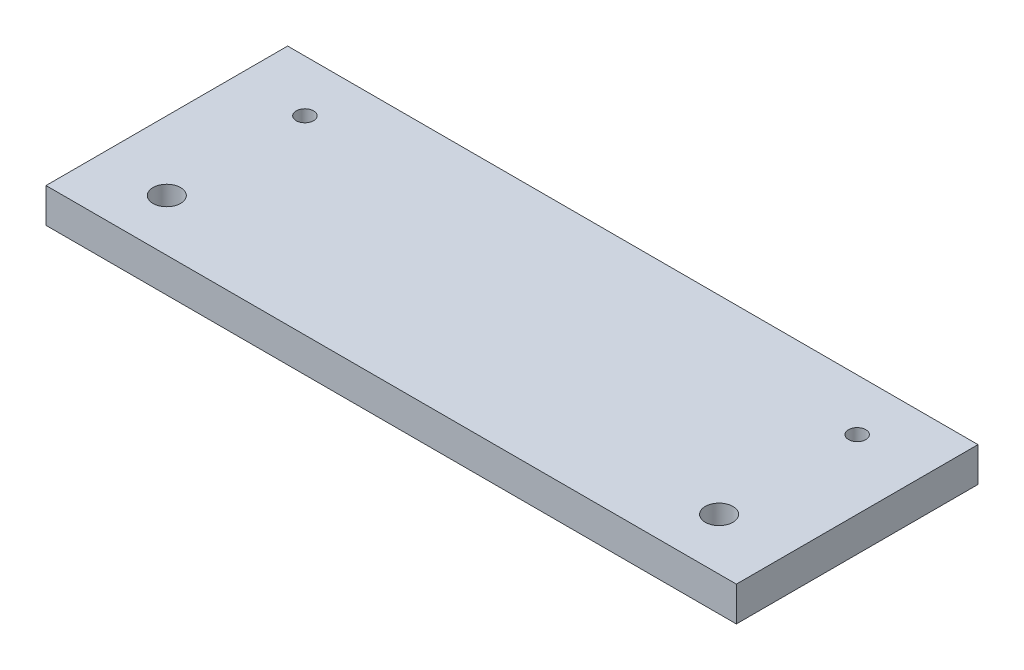
ISO-10303-21;
HEADER;
FILE_DESCRIPTION(('STEP AP214'),'2;1');
FILE_NAME('part.step','',(''),(''),'','','');
FILE_SCHEMA(('AUTOMOTIVE_DESIGN { 1 0 10303 214 1 1 1 1 }'));
ENDSEC;
DATA;
#1=APPLICATION_CONTEXT('core data for automotive mechanical design processes');
#2=APPLICATION_PROTOCOL_DEFINITION('international standard','automotive_design',2000,#1);
#3=PRODUCT_CONTEXT('',#1,'mechanical');
#4=PRODUCT('Part','Part','',(#3));
#5=PRODUCT_RELATED_PRODUCT_CATEGORY('part','',(#4));
#6=PRODUCT_DEFINITION_FORMATION('','',#4);
#7=PRODUCT_DEFINITION_CONTEXT('part definition',#1,'design');
#8=PRODUCT_DEFINITION('design','',#6,#7);
#9=PRODUCT_DEFINITION_SHAPE('','',#8);
#10=(LENGTH_UNIT() NAMED_UNIT(*) SI_UNIT(.MILLI.,.METRE.));
#11=(NAMED_UNIT(*) PLANE_ANGLE_UNIT() SI_UNIT($,.RADIAN.));
#12=(NAMED_UNIT(*) SI_UNIT($,.STERADIAN.) SOLID_ANGLE_UNIT());
#13=UNCERTAINTY_MEASURE_WITH_UNIT(LENGTH_MEASURE(1.E-05),#10,'distance_accuracy_value','');
#14=(GEOMETRIC_REPRESENTATION_CONTEXT(3) GLOBAL_UNCERTAINTY_ASSIGNED_CONTEXT((#13)) GLOBAL_UNIT_ASSIGNED_CONTEXT((#10,
#11,#12)) REPRESENTATION_CONTEXT('',''));
#15=CARTESIAN_POINT('',(0.,0.,0.));
#16=DIRECTION('',(0.,0.,1.));
#17=DIRECTION('',(1.,0.,0.));
#18=AXIS2_PLACEMENT_3D('',#15,#16,#17);
#19=CARTESIAN_POINT('',(0.,10.,0.));
#20=DIRECTION('',(0.,-1.,0.));
#21=DIRECTION('',(0.,0.,-1.));
#22=AXIS2_PLACEMENT_3D('',#19,#20,#21);
#23=PLANE('',#22);
#24=CARTESIAN_POINT('',(-80.,10.,20.));
#25=DIRECTION('',(0.,1.,0.));
#26=DIRECTION('',(0.,0.,1.));
#27=AXIS2_PLACEMENT_3D('',#24,#25,#26);
#28=CIRCLE('',#27,4.00000000000001);
#29=CARTESIAN_POINT('',(-80.,10.,24.));
#30=VERTEX_POINT('',#29);
#31=EDGE_CURVE('E139',#30,#30,#28,.T.);
#32=ORIENTED_EDGE('',*,*,#31,.F.);
#33=EDGE_LOOP('',(#32));
#34=FACE_BOUND('',#33,.T.);
#35=CARTESIAN_POINT('',(80.,10.,20.));
#36=DIRECTION('',(0.,-1.,0.));
#37=DIRECTION('',(0.,0.,-1.));
#38=AXIS2_PLACEMENT_3D('',#35,#36,#37);
#39=CIRCLE('',#38,4.00000000000001);
#40=CARTESIAN_POINT('',(80.,10.,16.));
#41=VERTEX_POINT('',#40);
#42=EDGE_CURVE('E134',#41,#41,#39,.T.);
#43=ORIENTED_EDGE('',*,*,#42,.T.);
#44=EDGE_LOOP('',(#43));
#45=FACE_BOUND('',#44,.T.);
#46=DIRECTION('',(0.,0.,-1.));
#47=VECTOR('',#46,1.);
#48=CARTESIAN_POINT('',(100.,10.,35.));
#49=LINE('',#48,#47);
#50=CARTESIAN_POINT('',(100.,10.,35.));
#51=VERTEX_POINT('',#50);
#52=CARTESIAN_POINT('',(100.,10.,-35.));
#53=VERTEX_POINT('',#52);
#54=EDGE_CURVE('E92',#51,#53,#49,.T.);
#55=ORIENTED_EDGE('',*,*,#54,.T.);
#56=DIRECTION('',(-1.,0.,0.));
#57=VECTOR('',#56,1.);
#58=CARTESIAN_POINT('',(-100.,10.,-35.));
#59=LINE('',#58,#57);
#60=CARTESIAN_POINT('',(-100.,10.,-35.));
#61=VERTEX_POINT('',#60);
#62=EDGE_CURVE('E87',#53,#61,#59,.T.);
#63=ORIENTED_EDGE('',*,*,#62,.T.);
#64=DIRECTION('',(0.,0.,1.));
#65=VECTOR('',#64,1.);
#66=CARTESIAN_POINT('',(-100.,10.,35.));
#67=LINE('',#66,#65);
#68=CARTESIAN_POINT('',(-100.,10.,35.));
#69=VERTEX_POINT('',#68);
#70=EDGE_CURVE('E90',#61,#69,#67,.T.);
#71=ORIENTED_EDGE('',*,*,#70,.T.);
#72=DIRECTION('',(1.,0.,0.));
#73=VECTOR('',#72,1.);
#74=CARTESIAN_POINT('',(-100.,10.,35.));
#75=LINE('',#74,#73);
#76=EDGE_CURVE('E57',#69,#51,#75,.T.);
#77=ORIENTED_EDGE('',*,*,#76,.T.);
#78=EDGE_LOOP('',(#55,#63,#71,#77));
#79=FACE_BOUND('',#78,.T.);
#80=CARTESIAN_POINT('',(80.,10.,-20.));
#81=DIRECTION('',(0.,-1.,0.));
#82=DIRECTION('',(0.,0.,-1.));
#83=AXIS2_PLACEMENT_3D('',#80,#81,#82);
#84=CIRCLE('',#83,2.50000000000001);
#85=CARTESIAN_POINT('',(80.,10.,-22.5));
#86=VERTEX_POINT('',#85);
#87=EDGE_CURVE('E150',#86,#86,#84,.T.);
#88=ORIENTED_EDGE('',*,*,#87,.T.);
#89=EDGE_LOOP('',(#88));
#90=FACE_BOUND('',#89,.T.);
#91=CARTESIAN_POINT('',(-80.,10.,-20.));
#92=DIRECTION('',(0.,1.,0.));
#93=DIRECTION('',(0.,0.,1.));
#94=AXIS2_PLACEMENT_3D('',#91,#92,#93);
#95=CIRCLE('',#94,2.50000000000001);
#96=CARTESIAN_POINT('',(-80.,10.,-17.5));
#97=VERTEX_POINT('',#96);
#98=EDGE_CURVE('E154',#97,#97,#95,.T.);
#99=ORIENTED_EDGE('',*,*,#98,.F.);
#100=EDGE_LOOP('',(#99));
#101=FACE_BOUND('',#100,.T.);
#102=ADVANCED_FACE('F39',(#34,#45,#79,#90,#101),#23,.F.);
#103=CARTESIAN_POINT('',(0.,0.,0.));
#104=DIRECTION('',(0.,-1.,0.));
#105=DIRECTION('',(0.,0.,-1.));
#106=AXIS2_PLACEMENT_3D('',#103,#104,#105);
#107=PLANE('',#106);
#108=CARTESIAN_POINT('',(80.,0.,-20.));
#109=DIRECTION('',(0.,-1.,0.));
#110=DIRECTION('',(0.,0.,-1.));
#111=AXIS2_PLACEMENT_3D('',#108,#109,#110);
#112=CIRCLE('',#111,2.50000000000001);
#113=CARTESIAN_POINT('',(80.,0.,-22.5));
#114=VERTEX_POINT('',#113);
#115=EDGE_CURVE('E146',#114,#114,#112,.T.);
#116=ORIENTED_EDGE('',*,*,#115,.F.);
#117=EDGE_LOOP('',(#116));
#118=FACE_BOUND('',#117,.T.);
#119=CARTESIAN_POINT('',(80.,0.,20.));
#120=DIRECTION('',(0.,-1.,0.));
#121=DIRECTION('',(0.,0.,-1.));
#122=AXIS2_PLACEMENT_3D('',#119,#120,#121);
#123=CIRCLE('',#122,4.00000000000001);
#124=CARTESIAN_POINT('',(80.,0.,16.));
#125=VERTEX_POINT('',#124);
#126=EDGE_CURVE('E130',#125,#125,#123,.T.);
#127=ORIENTED_EDGE('',*,*,#126,.F.);
#128=EDGE_LOOP('',(#127));
#129=FACE_BOUND('',#128,.T.);
#130=DIRECTION('',(0.,0.,-1.));
#131=VECTOR('',#130,1.);
#132=CARTESIAN_POINT('',(100.,0.,35.));
#133=LINE('',#132,#131);
#134=CARTESIAN_POINT('',(100.,0.,35.));
#135=VERTEX_POINT('',#134);
#136=CARTESIAN_POINT('',(100.,0.,-35.));
#137=VERTEX_POINT('',#136);
#138=EDGE_CURVE('E108',#135,#137,#133,.T.);
#139=ORIENTED_EDGE('',*,*,#138,.F.);
#140=DIRECTION('',(1.,0.,0.));
#141=VECTOR('',#140,1.);
#142=CARTESIAN_POINT('',(-100.,0.,35.));
#143=LINE('',#142,#141);
#144=CARTESIAN_POINT('',(-100.,0.,35.));
#145=VERTEX_POINT('',#144);
#146=EDGE_CURVE('E80',#145,#135,#143,.T.);
#147=ORIENTED_EDGE('',*,*,#146,.F.);
#148=DIRECTION('',(0.,0.,1.));
#149=VECTOR('',#148,1.);
#150=CARTESIAN_POINT('',(-100.,0.,35.));
#151=LINE('',#150,#149);
#152=CARTESIAN_POINT('',(-100.,0.,-35.));
#153=VERTEX_POINT('',#152);
#154=EDGE_CURVE('E74',#153,#145,#151,.T.);
#155=ORIENTED_EDGE('',*,*,#154,.F.);
#156=DIRECTION('',(-1.,0.,0.));
#157=VECTOR('',#156,1.);
#158=CARTESIAN_POINT('',(-100.,0.,-35.));
#159=LINE('',#158,#157);
#160=EDGE_CURVE('E97',#137,#153,#159,.T.);
#161=ORIENTED_EDGE('',*,*,#160,.F.);
#162=EDGE_LOOP('',(#139,#147,#155,#161));
#163=FACE_BOUND('',#162,.T.);
#164=CARTESIAN_POINT('',(-80.,0.,20.));
#165=DIRECTION('',(0.,1.,0.));
#166=DIRECTION('',(0.,0.,1.));
#167=AXIS2_PLACEMENT_3D('',#164,#165,#166);
#168=CIRCLE('',#167,4.00000000000001);
#169=CARTESIAN_POINT('',(-80.,0.,24.));
#170=VERTEX_POINT('',#169);
#171=EDGE_CURVE('E112',#170,#170,#168,.T.);
#172=ORIENTED_EDGE('',*,*,#171,.T.);
#173=EDGE_LOOP('',(#172));
#174=FACE_BOUND('',#173,.T.);
#175=CARTESIAN_POINT('',(-80.,0.,-20.));
#176=DIRECTION('',(0.,1.,0.));
#177=DIRECTION('',(0.,0.,1.));
#178=AXIS2_PLACEMENT_3D('',#175,#176,#177);
#179=CIRCLE('',#178,2.50000000000001);
#180=CARTESIAN_POINT('',(-80.,0.,-17.5));
#181=VERTEX_POINT('',#180);
#182=EDGE_CURVE('E135',#181,#181,#179,.T.);
#183=ORIENTED_EDGE('',*,*,#182,.T.);
#184=EDGE_LOOP('',(#183));
#185=FACE_BOUND('',#184,.T.);
#186=ADVANCED_FACE('F125',(#118,#129,#163,#174,#185),#107,.T.);
#187=CARTESIAN_POINT('',(100.,10.,35.));
#188=DIRECTION('',(-1.,0.,0.));
#189=DIRECTION('',(0.,0.,1.));
#190=AXIS2_PLACEMENT_3D('',#187,#188,#189);
#191=PLANE('',#190);
#192=ORIENTED_EDGE('',*,*,#138,.T.);
#193=DIRECTION('',(0.,-1.,0.));
#194=VECTOR('',#193,1.);
#195=CARTESIAN_POINT('',(100.,10.,-35.));
#196=LINE('',#195,#194);
#197=EDGE_CURVE('E11',#53,#137,#196,.T.);
#198=ORIENTED_EDGE('',*,*,#197,.F.);
#199=ORIENTED_EDGE('',*,*,#54,.F.);
#200=DIRECTION('',(0.,-1.,0.));
#201=VECTOR('',#200,1.);
#202=CARTESIAN_POINT('',(100.,10.,35.));
#203=LINE('',#202,#201);
#204=EDGE_CURVE('E104',#51,#135,#203,.T.);
#205=ORIENTED_EDGE('',*,*,#204,.T.);
#206=EDGE_LOOP('',(#192,#198,#199,#205));
#207=FACE_BOUND('',#206,.T.);
#208=ADVANCED_FACE('F41',(#207),#191,.F.);
#209=CARTESIAN_POINT('',(-100.,10.,-35.));
#210=DIRECTION('',(0.,0.,1.));
#211=DIRECTION('',(1.,0.,0.));
#212=AXIS2_PLACEMENT_3D('',#209,#210,#211);
#213=PLANE('',#212);
#214=ORIENTED_EDGE('',*,*,#160,.T.);
#215=DIRECTION('',(0.,-1.,0.));
#216=VECTOR('',#215,1.);
#217=CARTESIAN_POINT('',(-100.,10.,-35.));
#218=LINE('',#217,#216);
#219=EDGE_CURVE('E49',#61,#153,#218,.T.);
#220=ORIENTED_EDGE('',*,*,#219,.F.);
#221=ORIENTED_EDGE('',*,*,#62,.F.);
#222=ORIENTED_EDGE('',*,*,#197,.T.);
#223=EDGE_LOOP('',(#214,#220,#221,#222));
#224=FACE_BOUND('',#223,.T.);
#225=ADVANCED_FACE('F96',(#224),#213,.F.);
#226=CARTESIAN_POINT('',(-100.,10.,35.));
#227=DIRECTION('',(1.,0.,0.));
#228=DIRECTION('',(0.,0.,-1.));
#229=AXIS2_PLACEMENT_3D('',#226,#227,#228);
#230=PLANE('',#229);
#231=ORIENTED_EDGE('',*,*,#154,.T.);
#232=DIRECTION('',(0.,-1.,0.));
#233=VECTOR('',#232,1.);
#234=CARTESIAN_POINT('',(-100.,10.,35.));
#235=LINE('',#234,#233);
#236=EDGE_CURVE('E99',#69,#145,#235,.T.);
#237=ORIENTED_EDGE('',*,*,#236,.F.);
#238=ORIENTED_EDGE('',*,*,#70,.F.);
#239=ORIENTED_EDGE('',*,*,#219,.T.);
#240=EDGE_LOOP('',(#231,#237,#238,#239));
#241=FACE_BOUND('',#240,.T.);
#242=ADVANCED_FACE('F100',(#241),#230,.F.);
#243=CARTESIAN_POINT('',(-100.,10.,35.));
#244=DIRECTION('',(0.,0.,-1.));
#245=DIRECTION('',(-1.,0.,0.));
#246=AXIS2_PLACEMENT_3D('',#243,#244,#245);
#247=PLANE('',#246);
#248=ORIENTED_EDGE('',*,*,#146,.T.);
#249=ORIENTED_EDGE('',*,*,#204,.F.);
#250=ORIENTED_EDGE('',*,*,#76,.F.);
#251=ORIENTED_EDGE('',*,*,#236,.T.);
#252=EDGE_LOOP('',(#248,#249,#250,#251));
#253=FACE_BOUND('',#252,.T.);
#254=ADVANCED_FACE('F122',(#253),#247,.F.);
#255=CARTESIAN_POINT('',(80.,0.,20.));
#256=DIRECTION('',(0.,1.,0.));
#257=DIRECTION('',(0.,0.,1.));
#258=AXIS2_PLACEMENT_3D('',#255,#256,#257);
#259=CYLINDRICAL_SURFACE('',#258,4.00000000000001);
#260=ORIENTED_EDGE('',*,*,#126,.T.);
#261=EDGE_LOOP('',(#260));
#262=FACE_BOUND('',#261,.T.);
#263=ORIENTED_EDGE('',*,*,#42,.F.);
#264=EDGE_LOOP('',(#263));
#265=FACE_BOUND('',#264,.T.);
#266=ADVANCED_FACE('F181',(#262,#265),#259,.F.);
#267=CARTESIAN_POINT('',(-80.,0.,20.));
#268=DIRECTION('',(0.,1.,0.));
#269=DIRECTION('',(0.,0.,1.));
#270=AXIS2_PLACEMENT_3D('',#267,#268,#269);
#271=CYLINDRICAL_SURFACE('',#270,4.00000000000001);
#272=ORIENTED_EDGE('',*,*,#171,.F.);
#273=EDGE_LOOP('',(#272));
#274=FACE_BOUND('',#273,.T.);
#275=ORIENTED_EDGE('',*,*,#31,.T.);
#276=EDGE_LOOP('',(#275));
#277=FACE_BOUND('',#276,.T.);
#278=ADVANCED_FACE('F210',(#274,#277),#271,.F.);
#279=CARTESIAN_POINT('',(80.,0.,-20.));
#280=DIRECTION('',(0.,1.,0.));
#281=DIRECTION('',(0.,0.,1.));
#282=AXIS2_PLACEMENT_3D('',#279,#280,#281);
#283=CYLINDRICAL_SURFACE('',#282,2.50000000000001);
#284=ORIENTED_EDGE('',*,*,#115,.T.);
#285=EDGE_LOOP('',(#284));
#286=FACE_BOUND('',#285,.T.);
#287=ORIENTED_EDGE('',*,*,#87,.F.);
#288=EDGE_LOOP('',(#287));
#289=FACE_BOUND('',#288,.T.);
#290=ADVANCED_FACE('F166',(#286,#289),#283,.F.);
#291=CARTESIAN_POINT('',(-80.,0.,-20.));
#292=DIRECTION('',(0.,1.,0.));
#293=DIRECTION('',(0.,0.,1.));
#294=AXIS2_PLACEMENT_3D('',#291,#292,#293);
#295=CYLINDRICAL_SURFACE('',#294,2.50000000000001);
#296=ORIENTED_EDGE('',*,*,#182,.F.);
#297=EDGE_LOOP('',(#296));
#298=FACE_BOUND('',#297,.T.);
#299=ORIENTED_EDGE('',*,*,#98,.T.);
#300=EDGE_LOOP('',(#299));
#301=FACE_BOUND('',#300,.T.);
#302=ADVANCED_FACE('F163',(#298,#301),#295,.F.);
#303=CLOSED_SHELL('',(#102,#186,#208,#225,#242,#254,#266,#278,#290,#302));
#304=MANIFOLD_SOLID_BREP('B2',#303);
#305=ADVANCED_BREP_SHAPE_REPRESENTATION('',(#18,#304),#14);
#306=SHAPE_DEFINITION_REPRESENTATION(#9,#305);
ENDSEC;
END-ISO-10303-21;
